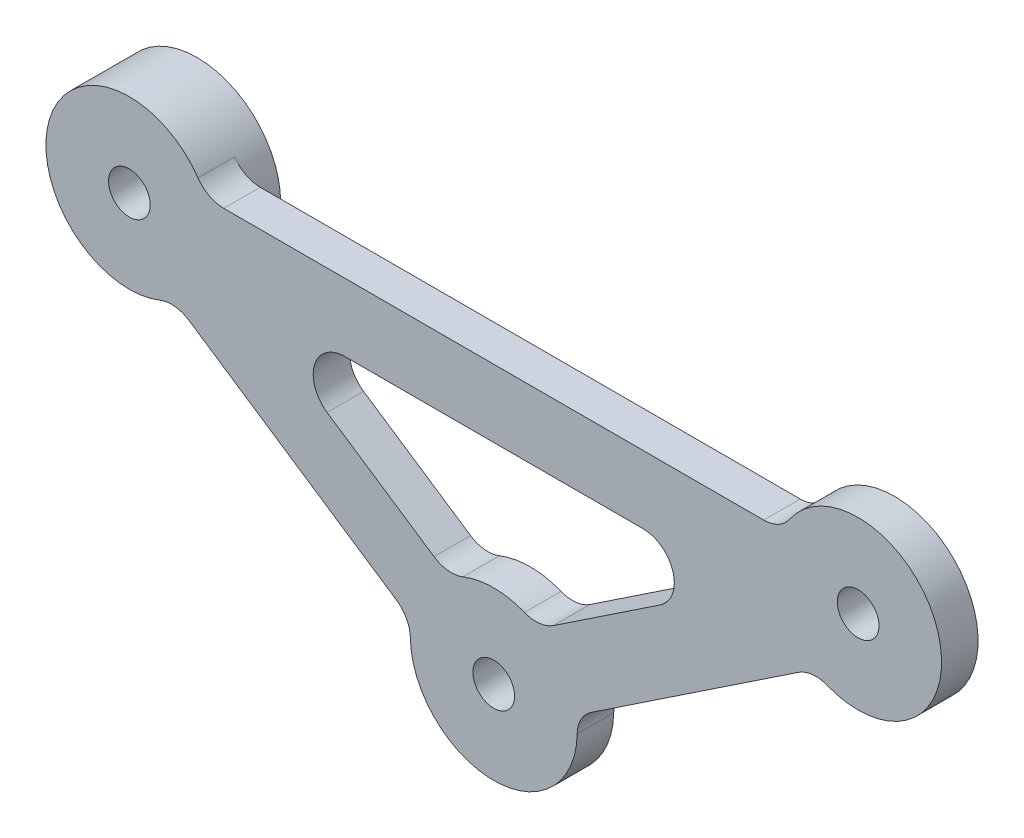
ISO-10303-21;
HEADER;
FILE_DESCRIPTION(('STEP AP214'),'2;1');
FILE_NAME('part.step','',(''),(''),'','','');
FILE_SCHEMA(('AUTOMOTIVE_DESIGN { 1 0 10303 214 1 1 1 1 }'));
ENDSEC;
DATA;
#1=APPLICATION_CONTEXT('core data for automotive mechanical design processes');
#2=APPLICATION_PROTOCOL_DEFINITION('international standard','automotive_design',2000,#1);
#3=PRODUCT_CONTEXT('',#1,'mechanical');
#4=PRODUCT('Part','Part','',(#3));
#5=PRODUCT_RELATED_PRODUCT_CATEGORY('part','',(#4));
#6=PRODUCT_DEFINITION_FORMATION('','',#4);
#7=PRODUCT_DEFINITION_CONTEXT('part definition',#1,'design');
#8=PRODUCT_DEFINITION('design','',#6,#7);
#9=PRODUCT_DEFINITION_SHAPE('','',#8);
#10=(LENGTH_UNIT() NAMED_UNIT(*) SI_UNIT(.MILLI.,.METRE.));
#11=(NAMED_UNIT(*) PLANE_ANGLE_UNIT() SI_UNIT($,.RADIAN.));
#12=(NAMED_UNIT(*) SI_UNIT($,.STERADIAN.) SOLID_ANGLE_UNIT());
#13=UNCERTAINTY_MEASURE_WITH_UNIT(LENGTH_MEASURE(1.E-05),#10,'distance_accuracy_value','');
#14=(GEOMETRIC_REPRESENTATION_CONTEXT(3) GLOBAL_UNCERTAINTY_ASSIGNED_CONTEXT((#13)) GLOBAL_UNIT_ASSIGNED_CONTEXT((#10,
#11,#12)) REPRESENTATION_CONTEXT('',''));
#15=CARTESIAN_POINT('',(0.,0.,0.));
#16=DIRECTION('',(0.,0.,1.));
#17=DIRECTION('',(1.,0.,0.));
#18=AXIS2_PLACEMENT_3D('',#15,#16,#17);
#19=CARTESIAN_POINT('',(-29.6214977386602,-38.3077999288982,-3.5));
#20=DIRECTION('',(0.,0.,1.));
#21=DIRECTION('',(1.,0.,0.));
#22=AXIS2_PLACEMENT_3D('',#19,#20,#21);
#23=PLANE('',#22);
#24=CARTESIAN_POINT('',(5.31275981201375,-61.6229805926456,-3.5));
#25=DIRECTION('',(0.,0.,1.));
#26=DIRECTION('',(1.,0.,0.));
#27=AXIS2_PLACEMENT_3D('',#24,#25,#26);
#28=CIRCLE('',#27,2.);
#29=CARTESIAN_POINT('',(7.31275981201375,-61.6229805926456,-3.5));
#30=VERTEX_POINT('',#29);
#31=EDGE_CURVE('E391',#30,#30,#28,.T.);
#32=ORIENTED_EDGE('',*,*,#31,.T.);
#33=EDGE_LOOP('',(#32));
#34=FACE_BOUND('',#33,.T.);
#35=CARTESIAN_POINT('',(40.2470173626877,-38.3077999288982,-3.5));
#36=DIRECTION('',(0.,0.,1.));
#37=DIRECTION('',(1.,0.,0.));
#38=AXIS2_PLACEMENT_3D('',#35,#36,#37);
#39=CIRCLE('',#38,2.);
#40=CARTESIAN_POINT('',(42.2470173626877,-38.3077999288982,-3.5));
#41=VERTEX_POINT('',#40);
#42=EDGE_CURVE('E415',#41,#41,#39,.T.);
#43=ORIENTED_EDGE('',*,*,#42,.T.);
#44=EDGE_LOOP('',(#43));
#45=FACE_BOUND('',#44,.T.);
#46=CARTESIAN_POINT('',(5.31275981201375,-61.6229805926456,-3.5));
#47=DIRECTION('',(0.,0.,1.));
#48=DIRECTION('',(1.,0.,0.));
#49=AXIS2_PLACEMENT_3D('',#46,#47,#48);
#50=CIRCLE('',#49,8.);
#51=CARTESIAN_POINT('',(8.26518746398824,-54.1877152335709,-3.5));
#52=VERTEX_POINT('',#51);
#53=CARTESIAN_POINT('',(2.36033216003925,-54.1877152335709,-3.5));
#54=VERTEX_POINT('',#53);
#55=EDGE_CURVE('E407',#52,#54,#50,.T.);
#56=ORIENTED_EDGE('',*,*,#55,.F.);
#57=CARTESIAN_POINT('',(9.37234783347867,-51.3994907239179,-3.5));
#58=DIRECTION('',(0.,0.,1.));
#59=DIRECTION('',(1.,0.,0.));
#60=AXIS2_PLACEMENT_3D('',#57,#58,#59);
#61=CIRCLE('',#60,3.);
#62=CARTESIAN_POINT('',(11.0377178808892,-53.8947948346803,-3.5));
#63=VERTEX_POINT('',#62);
#64=EDGE_CURVE('E250',#52,#63,#61,.T.);
#65=ORIENTED_EDGE('',*,*,#64,.T.);
#66=DIRECTION('',(0.831768036920807,0.555123349136844,0.));
#67=VECTOR('',#66,1.);
#68=CARTESIAN_POINT('',(8.49921714884384,-55.588994377832,-3.5));
#69=LINE('',#68,#67);
#70=CARTESIAN_POINT('',(21.2889525490781,-47.0531040396606,-3.5));
#71=VERTEX_POINT('',#70);
#72=EDGE_CURVE('E228',#63,#71,#69,.T.);
#73=ORIENTED_EDGE('',*,*,#72,.T.);
#74=CARTESIAN_POINT('',(19.6235825016675,-44.5577999288982,-3.5));
#75=DIRECTION('',(0.,0.,1.));
#76=DIRECTION('',(1.,0.,0.));
#77=AXIS2_PLACEMENT_3D('',#74,#75,#76);
#78=CIRCLE('',#77,3.);
#79=CARTESIAN_POINT('',(19.6235825016675,-41.5577999288982,-3.5));
#80=VERTEX_POINT('',#79);
#81=EDGE_CURVE('E359',#71,#80,#78,.T.);
#82=ORIENTED_EDGE('',*,*,#81,.T.);
#83=DIRECTION('',(-1.,0.,0.));
#84=VECTOR('',#83,1.);
#85=CARTESIAN_POINT('',(35.3127598120137,-41.5577999288982,-3.5));
#86=LINE('',#85,#84);
#87=CARTESIAN_POINT('',(-8.99806287764002,-41.5577999288982,-3.5));
#88=VERTEX_POINT('',#87);
#89=EDGE_CURVE('E330',#80,#88,#86,.T.);
#90=ORIENTED_EDGE('',*,*,#89,.T.);
#91=CARTESIAN_POINT('',(-8.99806287764001,-44.5577999288982,-3.5));
#92=DIRECTION('',(0.,0.,1.));
#93=DIRECTION('',(1.,0.,0.));
#94=AXIS2_PLACEMENT_3D('',#91,#92,#93);
#95=CIRCLE('',#94,3.);
#96=CARTESIAN_POINT('',(-10.6634329250505,-47.0531040396606,-3.5));
#97=VERTEX_POINT('',#96);
#98=EDGE_CURVE('E254',#88,#97,#95,.T.);
#99=ORIENTED_EDGE('',*,*,#98,.T.);
#100=DIRECTION('',(0.831768036920807,-0.555123349136844,0.));
#101=VECTOR('',#100,1.);
#102=CARTESIAN_POINT('',(-22.8267386324406,-38.9352939037266,-3.5));
#103=LINE('',#102,#101);
#104=CARTESIAN_POINT('',(-0.412198256861712,-53.8947948346803,-3.5));
#105=VERTEX_POINT('',#104);
#106=EDGE_CURVE('E368',#97,#105,#103,.T.);
#107=ORIENTED_EDGE('',*,*,#106,.T.);
#108=CARTESIAN_POINT('',(1.25317179054882,-51.3994907239179,-3.5));
#109=DIRECTION('',(0.,0.,1.));
#110=DIRECTION('',(1.,0.,0.));
#111=AXIS2_PLACEMENT_3D('',#108,#109,#110);
#112=CIRCLE('',#111,3.);
#113=EDGE_CURVE('E249',#105,#54,#112,.T.);
#114=ORIENTED_EDGE('',*,*,#113,.T.);
#115=EDGE_LOOP('',(#56,#65,#73,#82,#90,#99,#107,#114));
#116=FACE_BOUND('',#115,.T.);
#117=CARTESIAN_POINT('',(-29.6214977386602,-38.3077999288982,-3.5));
#118=DIRECTION('',(0.,0.,-1.));
#119=DIRECTION('',(-1.,0.,0.));
#120=AXIS2_PLACEMENT_3D('',#117,#118,#119);
#121=CIRCLE('',#120,8.);
#122=CARTESIAN_POINT('',(-23.0382733785759,-33.7623453834437,-3.5));
#123=VERTEX_POINT('',#122);
#124=CARTESIAN_POINT('',(-26.6690700866857,-45.7430652879729,-3.5));
#125=VERTEX_POINT('',#124);
#126=EDGE_CURVE('E326',#123,#125,#121,.T.);
#127=ORIENTED_EDGE('',*,*,#126,.F.);
#128=CARTESIAN_POINT('',(-20.5695642435443,-32.0577999288982,-3.5));
#129=DIRECTION('',(0.,0.,1.));
#130=DIRECTION('',(1.,0.,0.));
#131=AXIS2_PLACEMENT_3D('',#128,#129,#130);
#132=CIRCLE('',#131,3.);
#133=CARTESIAN_POINT('',(-20.5695642435443,-35.0577999288982,-3.5));
#134=VERTEX_POINT('',#133);
#135=EDGE_CURVE('E12',#123,#134,#132,.T.);
#136=ORIENTED_EDGE('',*,*,#135,.T.);
#137=DIRECTION('',(-1.,0.,0.));
#138=VECTOR('',#137,1.);
#139=CARTESIAN_POINT('',(35.3127598120137,-35.0577999288982,-3.5));
#140=LINE('',#139,#138);
#141=CARTESIAN_POINT('',(31.1950838675718,-35.0577999288982,-3.5));
#142=VERTEX_POINT('',#141);
#143=EDGE_CURVE('E324',#142,#134,#140,.T.);
#144=ORIENTED_EDGE('',*,*,#143,.F.);
#145=CARTESIAN_POINT('',(31.1950838675718,-32.0577999288982,-3.5));
#146=DIRECTION('',(0.,0.,1.));
#147=DIRECTION('',(1.,0.,0.));
#148=AXIS2_PLACEMENT_3D('',#145,#146,#147);
#149=CIRCLE('',#148,3.);
#150=CARTESIAN_POINT('',(33.6637930026034,-33.7623453834436,-3.5));
#151=VERTEX_POINT('',#150);
#152=EDGE_CURVE('E307',#142,#151,#149,.T.);
#153=ORIENTED_EDGE('',*,*,#152,.T.);
#154=CARTESIAN_POINT('',(40.2470173626877,-38.3077999288982,-3.5));
#155=DIRECTION('',(0.,0.,1.));
#156=DIRECTION('',(1.,0.,0.));
#157=AXIS2_PLACEMENT_3D('',#154,#155,#156);
#158=CIRCLE('',#157,8.);
#159=CARTESIAN_POINT('',(37.2945897107132,-45.7430652879729,-3.5));
#160=VERTEX_POINT('',#159);
#161=EDGE_CURVE('E341',#160,#151,#158,.T.);
#162=ORIENTED_EDGE('',*,*,#161,.F.);
#163=CARTESIAN_POINT('',(36.1874293412227,-48.5312897976259,-3.5));
#164=DIRECTION('',(0.,0.,1.));
#165=DIRECTION('',(1.,0.,0.));
#166=AXIS2_PLACEMENT_3D('',#163,#164,#165);
#167=CIRCLE('',#166,3.);
#168=CARTESIAN_POINT('',(34.5220592938122,-46.0359856868635,-3.5));
#169=VERTEX_POINT('',#168);
#170=EDGE_CURVE('E304',#160,#169,#167,.T.);
#171=ORIENTED_EDGE('',*,*,#170,.T.);
#172=DIRECTION('',(0.831768036920807,0.555123349136844,0.));
#173=VECTOR('',#172,1.);
#174=CARTESIAN_POINT('',(12.1075189182333,-60.9954866178172,-3.5));
#175=LINE('',#174,#173);
#176=CARTESIAN_POINT('',(14.6460196502787,-59.3012870746656,-3.5));
#177=VERTEX_POINT('',#176);
#178=EDGE_CURVE('E242',#177,#169,#175,.T.);
#179=ORIENTED_EDGE('',*,*,#178,.F.);
#180=CARTESIAN_POINT('',(16.3113896976892,-61.796591185428,-3.5));
#181=DIRECTION('',(0.,0.,1.));
#182=DIRECTION('',(1.,0.,0.));
#183=AXIS2_PLACEMENT_3D('',#180,#181,#182);
#184=CIRCLE('',#183,3.);
#185=CARTESIAN_POINT('',(13.3117633652323,-61.7492428419419,-3.5));
#186=VERTEX_POINT('',#185);
#187=EDGE_CURVE('E298',#177,#186,#184,.T.);
#188=ORIENTED_EDGE('',*,*,#187,.T.);
#189=CARTESIAN_POINT('',(-2.68624374120478,-61.7492428419419,-3.5));
#190=VERTEX_POINT('',#189);
#191=EDGE_CURVE('E403',#190,#186,#50,.T.);
#192=ORIENTED_EDGE('',*,*,#191,.F.);
#193=CARTESIAN_POINT('',(-5.68587007366173,-61.796591185428,-3.5));
#194=DIRECTION('',(0.,0.,1.));
#195=DIRECTION('',(1.,0.,0.));
#196=AXIS2_PLACEMENT_3D('',#193,#194,#195);
#197=CIRCLE('',#196,3.);
#198=CARTESIAN_POINT('',(-4.0205000262512,-59.3012870746656,-3.5));
#199=VERTEX_POINT('',#198);
#200=EDGE_CURVE('E294',#190,#199,#197,.T.);
#201=ORIENTED_EDGE('',*,*,#200,.T.);
#202=DIRECTION('',(0.831768036920807,-0.555123349136844,0.));
#203=VECTOR('',#202,1.);
#204=CARTESIAN_POINT('',(-26.4350404018301,-44.3417861437119,-3.5));
#205=LINE('',#204,#203);
#206=CARTESIAN_POINT('',(-23.8965396697847,-46.0359856868635,-3.5));
#207=VERTEX_POINT('',#206);
#208=EDGE_CURVE('E379',#207,#199,#205,.T.);
#209=ORIENTED_EDGE('',*,*,#208,.F.);
#210=CARTESIAN_POINT('',(-25.5619097171952,-48.5312897976259,-3.5));
#211=DIRECTION('',(0.,0.,1.));
#212=DIRECTION('',(1.,0.,0.));
#213=AXIS2_PLACEMENT_3D('',#210,#211,#212);
#214=CIRCLE('',#213,3.);
#215=EDGE_CURVE('E289',#207,#125,#214,.T.);
#216=ORIENTED_EDGE('',*,*,#215,.T.);
#217=EDGE_LOOP('',(#127,#136,#144,#153,#162,#171,#179,#188,#192,#201,#209,#216));
#218=FACE_BOUND('',#217,.T.);
#219=ADVANCED_FACE('F83',(#34,#45,#116,#218),#23,.F.);
#220=CARTESIAN_POINT('',(35.3127598120137,-41.5577999288982,-3.5));
#221=DIRECTION('',(0.,1.,0.));
#222=DIRECTION('',(-1.,0.,0.));
#223=AXIS2_PLACEMENT_3D('',#220,#221,#222);
#224=PLANE('',#223);
#225=ORIENTED_EDGE('',*,*,#89,.F.);
#226=DIRECTION('',(0.,0.,-1.));
#227=VECTOR('',#226,1.);
#228=CARTESIAN_POINT('',(19.6235825016675,-41.5577999288982,0.));
#229=LINE('',#228,#227);
#230=CARTESIAN_POINT('',(19.6235825016675,-41.5577999288982,0.));
#231=VERTEX_POINT('',#230);
#232=EDGE_CURVE('E348',#80,#231,#229,.F.);
#233=ORIENTED_EDGE('',*,*,#232,.T.);
#234=DIRECTION('',(-1.,0.,0.));
#235=VECTOR('',#234,1.);
#236=CARTESIAN_POINT('',(35.3127598120137,-41.5577999288982,0.));
#237=LINE('',#236,#235);
#238=CARTESIAN_POINT('',(-8.99806287764002,-41.5577999288982,0.));
#239=VERTEX_POINT('',#238);
#240=EDGE_CURVE('E331',#231,#239,#237,.T.);
#241=ORIENTED_EDGE('',*,*,#240,.T.);
#242=DIRECTION('',(0.,0.,1.));
#243=VECTOR('',#242,1.);
#244=CARTESIAN_POINT('',(-8.99806287764001,-41.5577999288982,-3.5));
#245=LINE('',#244,#243);
#246=EDGE_CURVE('E346',#239,#88,#245,.F.);
#247=ORIENTED_EDGE('',*,*,#246,.T.);
#248=EDGE_LOOP('',(#225,#233,#241,#247));
#249=FACE_BOUND('',#248,.T.);
#250=ADVANCED_FACE('F384',(#249),#224,.F.);
#251=CARTESIAN_POINT('',(5.31275981201375,-61.6229805926456,-3.5));
#252=DIRECTION('',(0.,0.,1.));
#253=DIRECTION('',(1.,0.,0.));
#254=AXIS2_PLACEMENT_3D('',#251,#252,#253);
#255=CYLINDRICAL_SURFACE('',#254,8.);
#256=CARTESIAN_POINT('',(5.31275981201375,-61.6229805926456,0.));
#257=DIRECTION('',(0.,0.,1.));
#258=DIRECTION('',(1.,0.,0.));
#259=AXIS2_PLACEMENT_3D('',#256,#257,#258);
#260=CIRCLE('',#259,8.);
#261=CARTESIAN_POINT('',(8.26518746398824,-54.1877152335709,0.));
#262=VERTEX_POINT('',#261);
#263=CARTESIAN_POINT('',(2.36033216003925,-54.1877152335709,0.));
#264=VERTEX_POINT('',#263);
#265=EDGE_CURVE('E401',#262,#264,#260,.T.);
#266=ORIENTED_EDGE('',*,*,#265,.F.);
#267=DIRECTION('',(0.,0.,1.));
#268=VECTOR('',#267,1.);
#269=CARTESIAN_POINT('',(8.26518746398824,-54.1877152335709,-3.5));
#270=LINE('',#269,#268);
#271=EDGE_CURVE('E248',#262,#52,#270,.F.);
#272=ORIENTED_EDGE('',*,*,#271,.T.);
#273=ORIENTED_EDGE('',*,*,#55,.T.);
#274=DIRECTION('',(0.,0.,1.));
#275=VECTOR('',#274,1.);
#276=CARTESIAN_POINT('',(2.36033216003925,-54.1877152335709,-3.5));
#277=LINE('',#276,#275);
#278=EDGE_CURVE('E356',#54,#264,#277,.T.);
#279=ORIENTED_EDGE('',*,*,#278,.T.);
#280=EDGE_LOOP('',(#266,#272,#273,#279));
#281=FACE_BOUND('',#280,.T.);
#282=ADVANCED_FACE('F473',(#281),#255,.T.);
#283=CARTESIAN_POINT('',(-29.6214977386602,-38.3077999288982,-3.5));
#284=DIRECTION('',(0.,0.,1.));
#285=DIRECTION('',(1.,0.,0.));
#286=AXIS2_PLACEMENT_3D('',#283,#284,#285);
#287=CYLINDRICAL_SURFACE('',#286,8.);
#288=ORIENTED_EDGE('',*,*,#126,.T.);
#289=DIRECTION('',(0.,0.,1.));
#290=VECTOR('',#289,1.);
#291=CARTESIAN_POINT('',(-26.6690700866857,-45.7430652879729,-3.5));
#292=LINE('',#291,#290);
#293=CARTESIAN_POINT('',(-26.6690700866857,-45.7430652879729,0.));
#294=VERTEX_POINT('',#293);
#295=EDGE_CURVE('E267',#125,#294,#292,.T.);
#296=ORIENTED_EDGE('',*,*,#295,.T.);
#297=CARTESIAN_POINT('',(-29.6214977386602,-38.3077999288982,0.));
#298=DIRECTION('',(0.,0.,1.));
#299=DIRECTION('',(1.,0.,0.));
#300=AXIS2_PLACEMENT_3D('',#297,#298,#299);
#301=CIRCLE('',#300,8.);
#302=CARTESIAN_POINT('',(-23.0382733785759,-33.7623453834437,0.));
#303=VERTEX_POINT('',#302);
#304=EDGE_CURVE('E232',#303,#294,#301,.T.);
#305=ORIENTED_EDGE('',*,*,#304,.F.);
#306=DIRECTION('',(0.,0.,1.));
#307=VECTOR('',#306,1.);
#308=CARTESIAN_POINT('',(-23.0382733785759,-33.7623453834437,-3.5));
#309=LINE('',#308,#307);
#310=EDGE_CURVE('E264',#303,#123,#309,.F.);
#311=ORIENTED_EDGE('',*,*,#310,.T.);
#312=EDGE_LOOP('',(#288,#296,#305,#311));
#313=FACE_BOUND('',#312,.T.);
#314=CARTESIAN_POINT('',(-29.6214977386602,-38.3077999288982,-6.5));
#315=DIRECTION('',(0.,0.,-1.));
#316=DIRECTION('',(-1.,0.,0.));
#317=AXIS2_PLACEMENT_3D('',#314,#315,#316);
#318=CIRCLE('',#317,8.);
#319=CARTESIAN_POINT('',(-37.6214977386602,-38.3077999288982,-6.5));
#320=VERTEX_POINT('',#319);
#321=EDGE_CURVE('E398',#320,#320,#318,.T.);
#322=ORIENTED_EDGE('',*,*,#321,.F.);
#323=EDGE_LOOP('',(#322));
#324=FACE_BOUND('',#323,.T.);
#325=ADVANCED_FACE('F315',(#313,#324),#287,.T.);
#326=CARTESIAN_POINT('',(-29.6214977386602,-38.3077999288982,0.));
#327=DIRECTION('',(0.,0.,1.));
#328=DIRECTION('',(1.,0.,0.));
#329=AXIS2_PLACEMENT_3D('',#326,#327,#328);
#330=PLANE('',#329);
#331=ORIENTED_EDGE('',*,*,#240,.F.);
#332=CARTESIAN_POINT('',(19.6235825016675,-44.5577999288982,0.));
#333=DIRECTION('',(0.,0.,1.));
#334=DIRECTION('',(1.,0.,0.));
#335=AXIS2_PLACEMENT_3D('',#332,#333,#334);
#336=CIRCLE('',#335,3.);
#337=CARTESIAN_POINT('',(21.2889525490781,-47.0531040396606,0.));
#338=VERTEX_POINT('',#337);
#339=EDGE_CURVE('E241',#231,#338,#336,.F.);
#340=ORIENTED_EDGE('',*,*,#339,.T.);
#341=DIRECTION('',(0.831768036920807,0.555123349136844,0.));
#342=VECTOR('',#341,1.);
#343=CARTESIAN_POINT('',(8.49921714884384,-55.588994377832,0.));
#344=LINE('',#343,#342);
#345=CARTESIAN_POINT('',(11.0377178808892,-53.8947948346803,0.));
#346=VERTEX_POINT('',#345);
#347=EDGE_CURVE('E225',#346,#338,#344,.T.);
#348=ORIENTED_EDGE('',*,*,#347,.F.);
#349=CARTESIAN_POINT('',(9.37234783347867,-51.3994907239179,0.));
#350=DIRECTION('',(0.,0.,1.));
#351=DIRECTION('',(1.,0.,0.));
#352=AXIS2_PLACEMENT_3D('',#349,#350,#351);
#353=CIRCLE('',#352,3.);
#354=EDGE_CURVE('E238',#346,#262,#353,.F.);
#355=ORIENTED_EDGE('',*,*,#354,.T.);
#356=ORIENTED_EDGE('',*,*,#265,.T.);
#357=CARTESIAN_POINT('',(1.25317179054882,-51.3994907239179,0.));
#358=DIRECTION('',(0.,0.,1.));
#359=DIRECTION('',(1.,0.,0.));
#360=AXIS2_PLACEMENT_3D('',#357,#358,#359);
#361=CIRCLE('',#360,3.);
#362=CARTESIAN_POINT('',(-0.412198256861712,-53.8947948346803,0.));
#363=VERTEX_POINT('',#362);
#364=EDGE_CURVE('E252',#264,#363,#361,.F.);
#365=ORIENTED_EDGE('',*,*,#364,.T.);
#366=DIRECTION('',(0.831768036920807,-0.555123349136844,0.));
#367=VECTOR('',#366,1.);
#368=CARTESIAN_POINT('',(-22.8267386324406,-38.9352939037266,0.));
#369=LINE('',#368,#367);
#370=CARTESIAN_POINT('',(-10.6634329250505,-47.0531040396606,0.));
#371=VERTEX_POINT('',#370);
#372=EDGE_CURVE('E382',#371,#363,#369,.T.);
#373=ORIENTED_EDGE('',*,*,#372,.F.);
#374=CARTESIAN_POINT('',(-8.99806287764001,-44.5577999288982,0.));
#375=DIRECTION('',(0.,0.,1.));
#376=DIRECTION('',(1.,0.,0.));
#377=AXIS2_PLACEMENT_3D('',#374,#375,#376);
#378=CIRCLE('',#377,3.);
#379=EDGE_CURVE('E362',#371,#239,#378,.F.);
#380=ORIENTED_EDGE('',*,*,#379,.T.);
#381=EDGE_LOOP('',(#331,#340,#348,#355,#356,#365,#373,#380));
#382=FACE_BOUND('',#381,.T.);
#383=DIRECTION('',(0.831768036920807,-0.555123349136844,0.));
#384=VECTOR('',#383,1.);
#385=CARTESIAN_POINT('',(-26.4350404018301,-44.3417861437119,0.));
#386=LINE('',#385,#384);
#387=CARTESIAN_POINT('',(-23.8965396697847,-46.0359856868635,0.));
#388=VERTEX_POINT('',#387);
#389=CARTESIAN_POINT('',(-4.0205000262512,-59.3012870746656,0.));
#390=VERTEX_POINT('',#389);
#391=EDGE_CURVE('E406',#388,#390,#386,.T.);
#392=ORIENTED_EDGE('',*,*,#391,.T.);
#393=CARTESIAN_POINT('',(-5.68587007366173,-61.796591185428,0.));
#394=DIRECTION('',(0.,0.,1.));
#395=DIRECTION('',(1.,0.,0.));
#396=AXIS2_PLACEMENT_3D('',#393,#394,#395);
#397=CIRCLE('',#396,3.);
#398=CARTESIAN_POINT('',(-2.68624374120478,-61.7492428419419,0.));
#399=VERTEX_POINT('',#398);
#400=EDGE_CURVE('E296',#390,#399,#397,.F.);
#401=ORIENTED_EDGE('',*,*,#400,.T.);
#402=CARTESIAN_POINT('',(13.3117633652323,-61.7492428419419,0.));
#403=VERTEX_POINT('',#402);
#404=EDGE_CURVE('E408',#399,#403,#260,.T.);
#405=ORIENTED_EDGE('',*,*,#404,.T.);
#406=CARTESIAN_POINT('',(16.3113896976892,-61.796591185428,0.));
#407=DIRECTION('',(0.,0.,1.));
#408=DIRECTION('',(1.,0.,0.));
#409=AXIS2_PLACEMENT_3D('',#406,#407,#408);
#410=CIRCLE('',#409,3.);
#411=CARTESIAN_POINT('',(14.6460196502787,-59.3012870746656,0.));
#412=VERTEX_POINT('',#411);
#413=EDGE_CURVE('E300',#403,#412,#410,.F.);
#414=ORIENTED_EDGE('',*,*,#413,.T.);
#415=DIRECTION('',(0.831768036920807,0.555123349136844,0.));
#416=VECTOR('',#415,1.);
#417=CARTESIAN_POINT('',(12.1075189182333,-60.9954866178172,0.));
#418=LINE('',#417,#416);
#419=CARTESIAN_POINT('',(34.5220592938122,-46.0359856868635,0.));
#420=VERTEX_POINT('',#419);
#421=EDGE_CURVE('E243',#412,#420,#418,.T.);
#422=ORIENTED_EDGE('',*,*,#421,.T.);
#423=CARTESIAN_POINT('',(36.1874293412227,-48.5312897976259,0.));
#424=DIRECTION('',(0.,0.,1.));
#425=DIRECTION('',(1.,0.,0.));
#426=AXIS2_PLACEMENT_3D('',#423,#424,#425);
#427=CIRCLE('',#426,3.);
#428=CARTESIAN_POINT('',(37.2945897107132,-45.7430652879729,0.));
#429=VERTEX_POINT('',#428);
#430=EDGE_CURVE('E302',#420,#429,#427,.F.);
#431=ORIENTED_EDGE('',*,*,#430,.T.);
#432=CARTESIAN_POINT('',(40.2470173626877,-38.3077999288982,0.));
#433=DIRECTION('',(0.,0.,1.));
#434=DIRECTION('',(1.,0.,0.));
#435=AXIS2_PLACEMENT_3D('',#432,#433,#434);
#436=CIRCLE('',#435,8.);
#437=CARTESIAN_POINT('',(33.6637930026034,-33.7623453834436,0.));
#438=VERTEX_POINT('',#437);
#439=EDGE_CURVE('E338',#429,#438,#436,.T.);
#440=ORIENTED_EDGE('',*,*,#439,.T.);
#441=CARTESIAN_POINT('',(31.1950838675718,-32.0577999288982,0.));
#442=DIRECTION('',(0.,0.,1.));
#443=DIRECTION('',(1.,0.,0.));
#444=AXIS2_PLACEMENT_3D('',#441,#442,#443);
#445=CIRCLE('',#444,3.);
#446=CARTESIAN_POINT('',(31.1950838675718,-35.0577999288982,0.));
#447=VERTEX_POINT('',#446);
#448=EDGE_CURVE('E105',#438,#447,#445,.F.);
#449=ORIENTED_EDGE('',*,*,#448,.T.);
#450=DIRECTION('',(-1.,0.,0.));
#451=VECTOR('',#450,1.);
#452=CARTESIAN_POINT('',(35.3127598120137,-35.0577999288982,0.));
#453=LINE('',#452,#451);
#454=CARTESIAN_POINT('',(-20.5695642435443,-35.0577999288982,0.));
#455=VERTEX_POINT('',#454);
#456=EDGE_CURVE('E313',#447,#455,#453,.T.);
#457=ORIENTED_EDGE('',*,*,#456,.T.);
#458=CARTESIAN_POINT('',(-20.5695642435443,-32.0577999288982,0.));
#459=DIRECTION('',(0.,0.,1.));
#460=DIRECTION('',(1.,0.,0.));
#461=AXIS2_PLACEMENT_3D('',#458,#459,#460);
#462=CIRCLE('',#461,3.);
#463=EDGE_CURVE('E91',#455,#303,#462,.F.);
#464=ORIENTED_EDGE('',*,*,#463,.T.);
#465=ORIENTED_EDGE('',*,*,#304,.T.);
#466=CARTESIAN_POINT('',(-25.5619097171952,-48.5312897976259,0.));
#467=DIRECTION('',(0.,0.,1.));
#468=DIRECTION('',(1.,0.,0.));
#469=AXIS2_PLACEMENT_3D('',#466,#467,#468);
#470=CIRCLE('',#469,3.);
#471=EDGE_CURVE('E292',#294,#388,#470,.F.);
#472=ORIENTED_EDGE('',*,*,#471,.T.);
#473=EDGE_LOOP('',(#392,#401,#405,#414,#422,#431,#440,#449,#457,#464,#465,#472));
#474=FACE_BOUND('',#473,.T.);
#475=CARTESIAN_POINT('',(-29.6214977386602,-38.3077999288982,0.));
#476=DIRECTION('',(0.,0.,1.));
#477=DIRECTION('',(1.,0.,0.));
#478=AXIS2_PLACEMENT_3D('',#475,#476,#477);
#479=CIRCLE('',#478,2.);
#480=CARTESIAN_POINT('',(-27.6214977386602,-38.3077999288982,0.));
#481=VERTEX_POINT('',#480);
#482=EDGE_CURVE('E319',#481,#481,#479,.T.);
#483=ORIENTED_EDGE('',*,*,#482,.F.);
#484=EDGE_LOOP('',(#483));
#485=FACE_BOUND('',#484,.T.);
#486=CARTESIAN_POINT('',(40.2470173626877,-38.3077999288982,0.));
#487=DIRECTION('',(0.,0.,1.));
#488=DIRECTION('',(1.,0.,0.));
#489=AXIS2_PLACEMENT_3D('',#486,#487,#488);
#490=CIRCLE('',#489,2.);
#491=CARTESIAN_POINT('',(42.2470173626877,-38.3077999288982,0.));
#492=VERTEX_POINT('',#491);
#493=EDGE_CURVE('E378',#492,#492,#490,.T.);
#494=ORIENTED_EDGE('',*,*,#493,.F.);
#495=EDGE_LOOP('',(#494));
#496=FACE_BOUND('',#495,.T.);
#497=CARTESIAN_POINT('',(5.31275981201375,-61.6229805926456,0.));
#498=DIRECTION('',(0.,0.,1.));
#499=DIRECTION('',(1.,0.,0.));
#500=AXIS2_PLACEMENT_3D('',#497,#498,#499);
#501=CIRCLE('',#500,2.);
#502=CARTESIAN_POINT('',(7.31275981201375,-61.6229805926456,0.));
#503=VERTEX_POINT('',#502);
#504=EDGE_CURVE('E388',#503,#503,#501,.T.);
#505=ORIENTED_EDGE('',*,*,#504,.F.);
#506=EDGE_LOOP('',(#505));
#507=FACE_BOUND('',#506,.T.);
#508=ADVANCED_FACE('F236',(#382,#474,#485,#496,#507),#330,.T.);
#509=CARTESIAN_POINT('',(-29.6214977386602,-38.3077999288982,-3.5));
#510=DIRECTION('',(0.,0.,1.));
#511=DIRECTION('',(1.,0.,0.));
#512=AXIS2_PLACEMENT_3D('',#509,#510,#511);
#513=CYLINDRICAL_SURFACE('',#512,2.);
#514=ORIENTED_EDGE('',*,*,#482,.T.);
#515=EDGE_LOOP('',(#514));
#516=FACE_BOUND('',#515,.T.);
#517=CARTESIAN_POINT('',(-29.6214977386602,-38.3077999288982,-6.5));
#518=DIRECTION('',(0.,0.,-1.));
#519=DIRECTION('',(-1.,0.,0.));
#520=AXIS2_PLACEMENT_3D('',#517,#518,#519);
#521=CIRCLE('',#520,2.);
#522=CARTESIAN_POINT('',(-31.6214977386602,-38.3077999288982,-6.5));
#523=VERTEX_POINT('',#522);
#524=EDGE_CURVE('E531',#523,#523,#521,.T.);
#525=ORIENTED_EDGE('',*,*,#524,.T.);
#526=EDGE_LOOP('',(#525));
#527=FACE_BOUND('',#526,.T.);
#528=ADVANCED_FACE('F478',(#516,#527),#513,.F.);
#529=CARTESIAN_POINT('',(35.3127598120137,-35.0577999288982,-3.5));
#530=DIRECTION('',(0.,1.,0.));
#531=DIRECTION('',(-1.,0.,0.));
#532=AXIS2_PLACEMENT_3D('',#529,#530,#531);
#533=PLANE('',#532);
#534=ORIENTED_EDGE('',*,*,#456,.F.);
#535=DIRECTION('',(0.,0.,-1.));
#536=VECTOR('',#535,1.);
#537=CARTESIAN_POINT('',(31.1950838675718,-35.0577999288982,-3.5));
#538=LINE('',#537,#536);
#539=EDGE_CURVE('E287',#447,#142,#538,.T.);
#540=ORIENTED_EDGE('',*,*,#539,.T.);
#541=ORIENTED_EDGE('',*,*,#143,.T.);
#542=DIRECTION('',(0.,0.,-1.));
#543=VECTOR('',#542,1.);
#544=CARTESIAN_POINT('',(-20.5695642435443,-35.0577999288982,0.));
#545=LINE('',#544,#543);
#546=EDGE_CURVE('E285',#134,#455,#545,.F.);
#547=ORIENTED_EDGE('',*,*,#546,.T.);
#548=EDGE_LOOP('',(#534,#540,#541,#547));
#549=FACE_BOUND('',#548,.T.);
#550=ADVANCED_FACE('F328',(#549),#533,.T.);
#551=CARTESIAN_POINT('',(40.2470173626877,-38.3077999288982,-3.5));
#552=DIRECTION('',(0.,0.,1.));
#553=DIRECTION('',(1.,0.,0.));
#554=AXIS2_PLACEMENT_3D('',#551,#552,#553);
#555=CYLINDRICAL_SURFACE('',#554,8.);
#556=ORIENTED_EDGE('',*,*,#439,.F.);
#557=DIRECTION('',(0.,0.,1.));
#558=VECTOR('',#557,1.);
#559=CARTESIAN_POINT('',(37.2945897107132,-45.7430652879729,-3.5));
#560=LINE('',#559,#558);
#561=EDGE_CURVE('E283',#429,#160,#560,.F.);
#562=ORIENTED_EDGE('',*,*,#561,.T.);
#563=ORIENTED_EDGE('',*,*,#161,.T.);
#564=DIRECTION('',(0.,0.,1.));
#565=VECTOR('',#564,1.);
#566=CARTESIAN_POINT('',(33.6637930026034,-33.7623453834436,-3.5));
#567=LINE('',#566,#565);
#568=EDGE_CURVE('E280',#151,#438,#567,.T.);
#569=ORIENTED_EDGE('',*,*,#568,.T.);
#570=EDGE_LOOP('',(#556,#562,#563,#569));
#571=FACE_BOUND('',#570,.T.);
#572=ADVANCED_FACE('F425',(#571),#555,.T.);
#573=CARTESIAN_POINT('',(40.2470173626877,-38.3077999288982,-3.5));
#574=DIRECTION('',(0.,0.,1.));
#575=DIRECTION('',(1.,0.,0.));
#576=AXIS2_PLACEMENT_3D('',#573,#574,#575);
#577=CYLINDRICAL_SURFACE('',#576,2.);
#578=ORIENTED_EDGE('',*,*,#42,.F.);
#579=EDGE_LOOP('',(#578));
#580=FACE_BOUND('',#579,.T.);
#581=ORIENTED_EDGE('',*,*,#493,.T.);
#582=EDGE_LOOP('',(#581));
#583=FACE_BOUND('',#582,.T.);
#584=ADVANCED_FACE('F514',(#580,#583),#577,.F.);
#585=CARTESIAN_POINT('',(-22.8267386324406,-38.9352939037266,-3.5));
#586=DIRECTION('',(-0.555123349136844,-0.831768036920807,0.));
#587=DIRECTION('',(0.831768036920808,-0.555123349136844,0.));
#588=AXIS2_PLACEMENT_3D('',#585,#586,#587);
#589=PLANE('',#588);
#590=ORIENTED_EDGE('',*,*,#106,.F.);
#591=DIRECTION('',(0.,0.,1.));
#592=VECTOR('',#591,1.);
#593=CARTESIAN_POINT('',(-10.6634329250505,-47.0531040396606,0.));
#594=LINE('',#593,#592);
#595=EDGE_CURVE('E353',#97,#371,#594,.T.);
#596=ORIENTED_EDGE('',*,*,#595,.T.);
#597=ORIENTED_EDGE('',*,*,#372,.T.);
#598=DIRECTION('',(0.,0.,1.));
#599=VECTOR('',#598,1.);
#600=CARTESIAN_POINT('',(-0.412198256861715,-53.8947948346803,-3.5));
#601=LINE('',#600,#599);
#602=EDGE_CURVE('E350',#363,#105,#601,.F.);
#603=ORIENTED_EDGE('',*,*,#602,.T.);
#604=EDGE_LOOP('',(#590,#596,#597,#603));
#605=FACE_BOUND('',#604,.T.);
#606=ADVANCED_FACE('F374',(#605),#589,.F.);
#607=CARTESIAN_POINT('',(-26.4350404018301,-44.3417861437119,-3.5));
#608=DIRECTION('',(-0.555123349136844,-0.831768036920807,0.));
#609=DIRECTION('',(0.831768036920808,-0.555123349136844,0.));
#610=AXIS2_PLACEMENT_3D('',#607,#608,#609);
#611=PLANE('',#610);
#612=ORIENTED_EDGE('',*,*,#391,.F.);
#613=DIRECTION('',(0.,0.,-1.));
#614=VECTOR('',#613,1.);
#615=CARTESIAN_POINT('',(-23.8965396697847,-46.0359856868635,-3.5));
#616=LINE('',#615,#614);
#617=EDGE_CURVE('E261',#388,#207,#616,.T.);
#618=ORIENTED_EDGE('',*,*,#617,.T.);
#619=ORIENTED_EDGE('',*,*,#208,.T.);
#620=DIRECTION('',(0.,0.,-1.));
#621=VECTOR('',#620,1.);
#622=CARTESIAN_POINT('',(-4.0205000262512,-59.3012870746656,0.));
#623=LINE('',#622,#621);
#624=EDGE_CURVE('E259',#199,#390,#623,.F.);
#625=ORIENTED_EDGE('',*,*,#624,.T.);
#626=EDGE_LOOP('',(#612,#618,#619,#625));
#627=FACE_BOUND('',#626,.T.);
#628=ADVANCED_FACE('F451',(#627),#611,.T.);
#629=ORIENTED_EDGE('',*,*,#404,.F.);
#630=DIRECTION('',(0.,0.,1.));
#631=VECTOR('',#630,1.);
#632=CARTESIAN_POINT('',(-2.68624374120478,-61.7492428419419,-3.5));
#633=LINE('',#632,#631);
#634=EDGE_CURVE('E271',#399,#190,#633,.F.);
#635=ORIENTED_EDGE('',*,*,#634,.T.);
#636=ORIENTED_EDGE('',*,*,#191,.T.);
#637=DIRECTION('',(0.,0.,1.));
#638=VECTOR('',#637,1.);
#639=CARTESIAN_POINT('',(13.3117633652323,-61.7492428419419,-3.5));
#640=LINE('',#639,#638);
#641=EDGE_CURVE('E269',#186,#403,#640,.T.);
#642=ORIENTED_EDGE('',*,*,#641,.T.);
#643=EDGE_LOOP('',(#629,#635,#636,#642));
#644=FACE_BOUND('',#643,.T.);
#645=ADVANCED_FACE('F442',(#644),#255,.T.);
#646=CARTESIAN_POINT('',(5.31275981201375,-61.6229805926456,-3.5));
#647=DIRECTION('',(0.,0.,1.));
#648=DIRECTION('',(1.,0.,0.));
#649=AXIS2_PLACEMENT_3D('',#646,#647,#648);
#650=CYLINDRICAL_SURFACE('',#649,2.);
#651=ORIENTED_EDGE('',*,*,#31,.F.);
#652=EDGE_LOOP('',(#651));
#653=FACE_BOUND('',#652,.T.);
#654=ORIENTED_EDGE('',*,*,#504,.T.);
#655=EDGE_LOOP('',(#654));
#656=FACE_BOUND('',#655,.T.);
#657=ADVANCED_FACE('F504',(#653,#656),#650,.F.);
#658=CARTESIAN_POINT('',(8.49921714884384,-55.588994377832,-3.5));
#659=DIRECTION('',(0.555123349136844,-0.831768036920807,0.));
#660=DIRECTION('',(0.831768036920807,0.555123349136844,0.));
#661=AXIS2_PLACEMENT_3D('',#658,#659,#660);
#662=PLANE('',#661);
#663=ORIENTED_EDGE('',*,*,#347,.T.);
#664=DIRECTION('',(0.,0.,-1.));
#665=VECTOR('',#664,1.);
#666=CARTESIAN_POINT('',(21.288952549078,-47.0531040396606,-3.5));
#667=LINE('',#666,#665);
#668=EDGE_CURVE('E231',#338,#71,#667,.T.);
#669=ORIENTED_EDGE('',*,*,#668,.T.);
#670=ORIENTED_EDGE('',*,*,#72,.F.);
#671=DIRECTION('',(0.,0.,1.));
#672=VECTOR('',#671,1.);
#673=CARTESIAN_POINT('',(11.0377178808892,-53.8947948346803,-3.5));
#674=LINE('',#673,#672);
#675=EDGE_CURVE('E221',#63,#346,#674,.T.);
#676=ORIENTED_EDGE('',*,*,#675,.T.);
#677=EDGE_LOOP('',(#663,#669,#670,#676));
#678=FACE_BOUND('',#677,.T.);
#679=ADVANCED_FACE('F223',(#678),#662,.F.);
#680=CARTESIAN_POINT('',(12.1075189182333,-60.9954866178172,-3.5));
#681=DIRECTION('',(0.555123349136844,-0.831768036920807,0.));
#682=DIRECTION('',(0.831768036920807,0.555123349136844,0.));
#683=AXIS2_PLACEMENT_3D('',#680,#681,#682);
#684=PLANE('',#683);
#685=ORIENTED_EDGE('',*,*,#421,.F.);
#686=DIRECTION('',(0.,0.,-1.));
#687=VECTOR('',#686,1.);
#688=CARTESIAN_POINT('',(14.6460196502787,-59.3012870746656,-3.5));
#689=LINE('',#688,#687);
#690=EDGE_CURVE('E277',#412,#177,#689,.T.);
#691=ORIENTED_EDGE('',*,*,#690,.T.);
#692=ORIENTED_EDGE('',*,*,#178,.T.);
#693=DIRECTION('',(0.,0.,-1.));
#694=VECTOR('',#693,1.);
#695=CARTESIAN_POINT('',(34.5220592938122,-46.0359856868635,0.));
#696=LINE('',#695,#694);
#697=EDGE_CURVE('E274',#169,#420,#696,.F.);
#698=ORIENTED_EDGE('',*,*,#697,.T.);
#699=EDGE_LOOP('',(#685,#691,#692,#698));
#700=FACE_BOUND('',#699,.T.);
#701=ADVANCED_FACE('F433',(#700),#684,.T.);
#702=CARTESIAN_POINT('',(19.6235825016675,-44.5577999288982,-3.5));
#703=DIRECTION('',(0.,0.,1.));
#704=DIRECTION('',(1.,0.,0.));
#705=AXIS2_PLACEMENT_3D('',#702,#703,#704);
#706=CYLINDRICAL_SURFACE('',#705,3.);
#707=ORIENTED_EDGE('',*,*,#339,.F.);
#708=ORIENTED_EDGE('',*,*,#232,.F.);
#709=ORIENTED_EDGE('',*,*,#81,.F.);
#710=ORIENTED_EDGE('',*,*,#668,.F.);
#711=EDGE_LOOP('',(#707,#708,#709,#710));
#712=FACE_BOUND('',#711,.T.);
#713=ADVANCED_FACE('F387',(#712),#706,.F.);
#714=CARTESIAN_POINT('',(-8.99806287764001,-44.5577999288982,-3.5));
#715=DIRECTION('',(0.,0.,-1.));
#716=DIRECTION('',(-1.,0.,0.));
#717=AXIS2_PLACEMENT_3D('',#714,#715,#716);
#718=CYLINDRICAL_SURFACE('',#717,3.);
#719=ORIENTED_EDGE('',*,*,#98,.F.);
#720=ORIENTED_EDGE('',*,*,#246,.F.);
#721=ORIENTED_EDGE('',*,*,#379,.F.);
#722=ORIENTED_EDGE('',*,*,#595,.F.);
#723=EDGE_LOOP('',(#719,#720,#721,#722));
#724=FACE_BOUND('',#723,.T.);
#725=ADVANCED_FACE('F381',(#724),#718,.F.);
#726=CARTESIAN_POINT('',(9.37234783347867,-51.3994907239179,-3.5));
#727=DIRECTION('',(0.,0.,1.));
#728=DIRECTION('',(1.,0.,0.));
#729=AXIS2_PLACEMENT_3D('',#726,#727,#728);
#730=CYLINDRICAL_SURFACE('',#729,3.);
#731=ORIENTED_EDGE('',*,*,#354,.F.);
#732=ORIENTED_EDGE('',*,*,#675,.F.);
#733=ORIENTED_EDGE('',*,*,#64,.F.);
#734=ORIENTED_EDGE('',*,*,#271,.F.);
#735=EDGE_LOOP('',(#731,#732,#733,#734));
#736=FACE_BOUND('',#735,.T.);
#737=ADVANCED_FACE('F246',(#736),#730,.F.);
#738=CARTESIAN_POINT('',(1.25317179054882,-51.3994907239179,-3.5));
#739=DIRECTION('',(0.,0.,1.));
#740=DIRECTION('',(1.,0.,0.));
#741=AXIS2_PLACEMENT_3D('',#738,#739,#740);
#742=CYLINDRICAL_SURFACE('',#741,3.);
#743=ORIENTED_EDGE('',*,*,#364,.F.);
#744=ORIENTED_EDGE('',*,*,#278,.F.);
#745=ORIENTED_EDGE('',*,*,#113,.F.);
#746=ORIENTED_EDGE('',*,*,#602,.F.);
#747=EDGE_LOOP('',(#743,#744,#745,#746));
#748=FACE_BOUND('',#747,.T.);
#749=ADVANCED_FACE('F463',(#748),#742,.F.);
#750=CARTESIAN_POINT('',(-29.6214977386602,-38.3077999288982,-6.5));
#751=DIRECTION('',(0.,0.,-1.));
#752=DIRECTION('',(-1.,0.,0.));
#753=AXIS2_PLACEMENT_3D('',#750,#751,#752);
#754=PLANE('',#753);
#755=ORIENTED_EDGE('',*,*,#321,.T.);
#756=EDGE_LOOP('',(#755));
#757=FACE_BOUND('',#756,.T.);
#758=ORIENTED_EDGE('',*,*,#524,.F.);
#759=EDGE_LOOP('',(#758));
#760=FACE_BOUND('',#759,.T.);
#761=ADVANCED_FACE('F456',(#757,#760),#754,.T.);
#762=CARTESIAN_POINT('',(-25.5619097171952,-48.5312897976259,-3.5));
#763=DIRECTION('',(0.,0.,1.));
#764=DIRECTION('',(1.,0.,0.));
#765=AXIS2_PLACEMENT_3D('',#762,#763,#764);
#766=CYLINDRICAL_SURFACE('',#765,3.);
#767=ORIENTED_EDGE('',*,*,#471,.F.);
#768=ORIENTED_EDGE('',*,*,#295,.F.);
#769=ORIENTED_EDGE('',*,*,#215,.F.);
#770=ORIENTED_EDGE('',*,*,#617,.F.);
#771=EDGE_LOOP('',(#767,#768,#769,#770));
#772=FACE_BOUND('',#771,.T.);
#773=ADVANCED_FACE('F454',(#772),#766,.F.);
#774=CARTESIAN_POINT('',(-5.68587007366173,-61.796591185428,-3.5));
#775=DIRECTION('',(0.,0.,1.));
#776=DIRECTION('',(1.,0.,0.));
#777=AXIS2_PLACEMENT_3D('',#774,#775,#776);
#778=CYLINDRICAL_SURFACE('',#777,3.);
#779=ORIENTED_EDGE('',*,*,#400,.F.);
#780=ORIENTED_EDGE('',*,*,#624,.F.);
#781=ORIENTED_EDGE('',*,*,#200,.F.);
#782=ORIENTED_EDGE('',*,*,#634,.F.);
#783=EDGE_LOOP('',(#779,#780,#781,#782));
#784=FACE_BOUND('',#783,.T.);
#785=ADVANCED_FACE('F446',(#784),#778,.F.);
#786=CARTESIAN_POINT('',(16.3113896976892,-61.796591185428,-3.5));
#787=DIRECTION('',(0.,0.,1.));
#788=DIRECTION('',(1.,0.,0.));
#789=AXIS2_PLACEMENT_3D('',#786,#787,#788);
#790=CYLINDRICAL_SURFACE('',#789,3.);
#791=ORIENTED_EDGE('',*,*,#413,.F.);
#792=ORIENTED_EDGE('',*,*,#641,.F.);
#793=ORIENTED_EDGE('',*,*,#187,.F.);
#794=ORIENTED_EDGE('',*,*,#690,.F.);
#795=EDGE_LOOP('',(#791,#792,#793,#794));
#796=FACE_BOUND('',#795,.T.);
#797=ADVANCED_FACE('F437',(#796),#790,.F.);
#798=CARTESIAN_POINT('',(36.1874293412227,-48.5312897976259,-3.5));
#799=DIRECTION('',(0.,0.,1.));
#800=DIRECTION('',(1.,0.,0.));
#801=AXIS2_PLACEMENT_3D('',#798,#799,#800);
#802=CYLINDRICAL_SURFACE('',#801,3.);
#803=ORIENTED_EDGE('',*,*,#170,.F.);
#804=ORIENTED_EDGE('',*,*,#561,.F.);
#805=ORIENTED_EDGE('',*,*,#430,.F.);
#806=ORIENTED_EDGE('',*,*,#697,.F.);
#807=EDGE_LOOP('',(#803,#804,#805,#806));
#808=FACE_BOUND('',#807,.T.);
#809=ADVANCED_FACE('F428',(#808),#802,.F.);
#810=CARTESIAN_POINT('',(31.1950838675718,-32.0577999288982,-3.5));
#811=DIRECTION('',(0.,0.,1.));
#812=DIRECTION('',(1.,0.,0.));
#813=AXIS2_PLACEMENT_3D('',#810,#811,#812);
#814=CYLINDRICAL_SURFACE('',#813,3.);
#815=ORIENTED_EDGE('',*,*,#152,.F.);
#816=ORIENTED_EDGE('',*,*,#539,.F.);
#817=ORIENTED_EDGE('',*,*,#448,.F.);
#818=ORIENTED_EDGE('',*,*,#568,.F.);
#819=EDGE_LOOP('',(#815,#816,#817,#818));
#820=FACE_BOUND('',#819,.T.);
#821=ADVANCED_FACE('F593',(#820),#814,.F.);
#822=CARTESIAN_POINT('',(-20.5695642435443,-32.0577999288982,-3.5));
#823=DIRECTION('',(0.,0.,1.));
#824=DIRECTION('',(1.,0.,0.));
#825=AXIS2_PLACEMENT_3D('',#822,#823,#824);
#826=CYLINDRICAL_SURFACE('',#825,3.);
#827=ORIENTED_EDGE('',*,*,#135,.F.);
#828=ORIENTED_EDGE('',*,*,#310,.F.);
#829=ORIENTED_EDGE('',*,*,#463,.F.);
#830=ORIENTED_EDGE('',*,*,#546,.F.);
#831=EDGE_LOOP('',(#827,#828,#829,#830));
#832=FACE_BOUND('',#831,.T.);
#833=ADVANCED_FACE('F85',(#832),#826,.F.);
#834=CLOSED_SHELL('',(#219,#250,#282,#325,#508,#528,#550,#572,#584,#606,#628,#645,#657,#679,
#701,#713,#725,#737,#749,#761,#773,#785,#797,#809,#821,#833));
#835=MANIFOLD_SOLID_BREP('B2',#834);
#836=ADVANCED_BREP_SHAPE_REPRESENTATION('',(#18,#835),#14);
#837=SHAPE_DEFINITION_REPRESENTATION(#9,#836);
ENDSEC;
END-ISO-10303-21;
